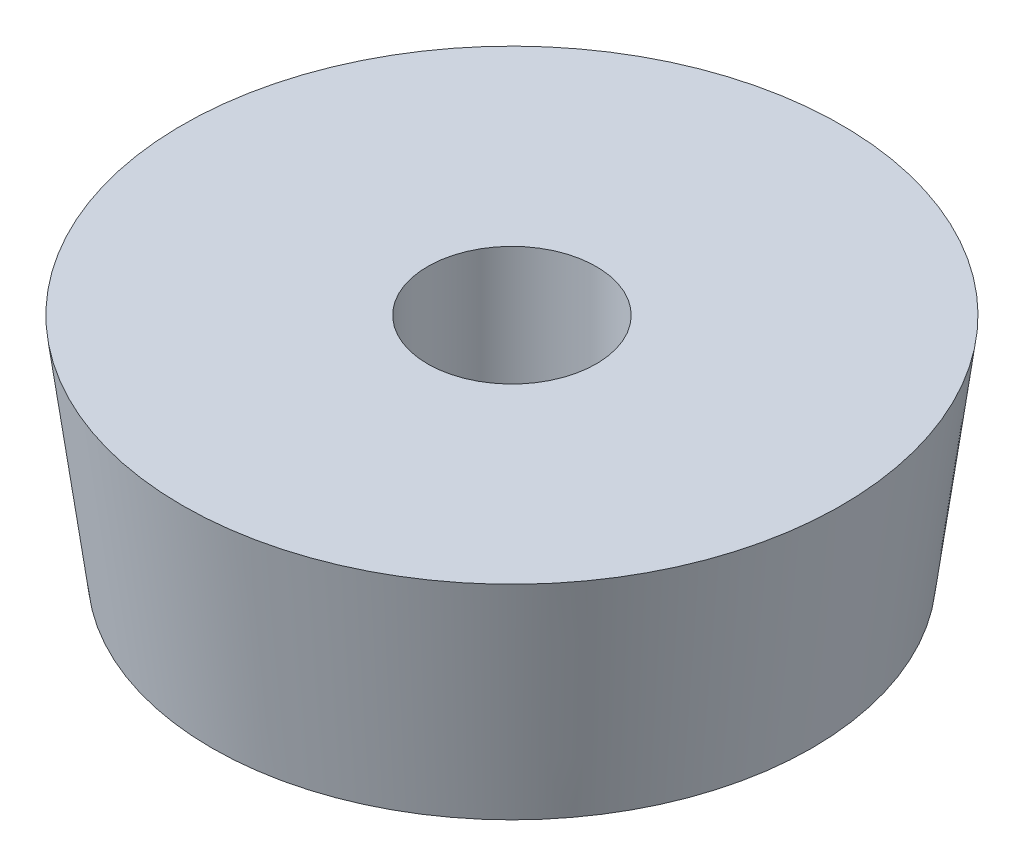
ISO-10303-21;
HEADER;
FILE_DESCRIPTION(('STEP AP214'),'2;1');
FILE_NAME('part.step','',(''),(''),'','','');
FILE_SCHEMA(('AUTOMOTIVE_DESIGN { 1 0 10303 214 1 1 1 1 }'));
ENDSEC;
DATA;
#1=APPLICATION_CONTEXT('core data for automotive mechanical design processes');
#2=APPLICATION_PROTOCOL_DEFINITION('international standard','automotive_design',2000,#1);
#3=PRODUCT_CONTEXT('',#1,'mechanical');
#4=PRODUCT('Part','Part','',(#3));
#5=PRODUCT_RELATED_PRODUCT_CATEGORY('part','',(#4));
#6=PRODUCT_DEFINITION_FORMATION('','',#4);
#7=PRODUCT_DEFINITION_CONTEXT('part definition',#1,'design');
#8=PRODUCT_DEFINITION('design','',#6,#7);
#9=PRODUCT_DEFINITION_SHAPE('','',#8);
#10=(LENGTH_UNIT() NAMED_UNIT(*) SI_UNIT(.MILLI.,.METRE.));
#11=(NAMED_UNIT(*) PLANE_ANGLE_UNIT() SI_UNIT($,.RADIAN.));
#12=(NAMED_UNIT(*) SI_UNIT($,.STERADIAN.) SOLID_ANGLE_UNIT());
#13=UNCERTAINTY_MEASURE_WITH_UNIT(LENGTH_MEASURE(1.E-05),#10,'distance_accuracy_value','');
#14=(GEOMETRIC_REPRESENTATION_CONTEXT(3) GLOBAL_UNCERTAINTY_ASSIGNED_CONTEXT((#13)) GLOBAL_UNIT_ASSIGNED_CONTEXT((#10,
#11,#12)) REPRESENTATION_CONTEXT('',''));
#15=CARTESIAN_POINT('',(0.,0.,0.));
#16=DIRECTION('',(0.,0.,1.));
#17=DIRECTION('',(1.,0.,0.));
#18=AXIS2_PLACEMENT_3D('',#15,#16,#17);
#19=CARTESIAN_POINT('',(0.,0.,0.));
#20=DIRECTION('',(0.,1.,0.));
#21=DIRECTION('',(0.,0.,1.));
#22=AXIS2_PLACEMENT_3D('',#19,#20,#21);
#23=CONICAL_SURFACE('',#22,50.8,0.130899693899575);
#24=CARTESIAN_POINT('',(0.,38.1,0.));
#25=DIRECTION('',(0.,1.,0.));
#26=DIRECTION('',(0.,0.,1.));
#27=AXIS2_PLACEMENT_3D('',#24,#25,#26);
#28=CIRCLE('',#27,55.8159601580798);
#29=CARTESIAN_POINT('',(0.,38.1,55.8159601580798));
#30=VERTEX_POINT('',#29);
#31=EDGE_CURVE('E10',#30,#30,#28,.T.);
#32=ORIENTED_EDGE('',*,*,#31,.F.);
#33=EDGE_LOOP('',(#32));
#34=FACE_BOUND('',#33,.T.);
#35=CARTESIAN_POINT('',(0.,0.,0.));
#36=DIRECTION('',(0.,1.,0.));
#37=DIRECTION('',(0.,0.,1.));
#38=AXIS2_PLACEMENT_3D('',#35,#36,#37);
#39=CIRCLE('',#38,50.8);
#40=CARTESIAN_POINT('',(0.,0.,50.8));
#41=VERTEX_POINT('',#40);
#42=EDGE_CURVE('E36',#41,#41,#39,.T.);
#43=ORIENTED_EDGE('',*,*,#42,.T.);
#44=EDGE_LOOP('',(#43));
#45=FACE_BOUND('',#44,.T.);
#46=ADVANCED_FACE('F30',(#34,#45),#23,.T.);
#47=CARTESIAN_POINT('',(0.,38.1,0.));
#48=DIRECTION('',(0.,1.,0.));
#49=DIRECTION('',(0.,0.,1.));
#50=AXIS2_PLACEMENT_3D('',#47,#48,#49);
#51=PLANE('',#50);
#52=CARTESIAN_POINT('',(0.,38.1,0.));
#53=DIRECTION('',(0.,1.,0.));
#54=DIRECTION('',(0.,0.,1.));
#55=AXIS2_PLACEMENT_3D('',#52,#53,#54);
#56=CIRCLE('',#55,14.2875);
#57=CARTESIAN_POINT('',(0.,38.1,14.2875));
#58=VERTEX_POINT('',#57);
#59=EDGE_CURVE('E44',#58,#58,#56,.T.);
#60=ORIENTED_EDGE('',*,*,#59,.F.);
#61=EDGE_LOOP('',(#60));
#62=FACE_BOUND('',#61,.T.);
#63=ORIENTED_EDGE('',*,*,#31,.T.);
#64=EDGE_LOOP('',(#63));
#65=FACE_BOUND('',#64,.T.);
#66=ADVANCED_FACE('F52',(#62,#65),#51,.T.);
#67=CARTESIAN_POINT('',(0.,0.,0.));
#68=DIRECTION('',(0.,1.,0.));
#69=DIRECTION('',(0.,0.,1.));
#70=AXIS2_PLACEMENT_3D('',#67,#68,#69);
#71=PLANE('',#70);
#72=CARTESIAN_POINT('',(0.,0.,0.));
#73=DIRECTION('',(0.,1.,0.));
#74=DIRECTION('',(0.,0.,1.));
#75=AXIS2_PLACEMENT_3D('',#72,#73,#74);
#76=CIRCLE('',#75,14.2875);
#77=CARTESIAN_POINT('',(0.,0.,14.2875));
#78=VERTEX_POINT('',#77);
#79=EDGE_CURVE('E40',#78,#78,#76,.T.);
#80=ORIENTED_EDGE('',*,*,#79,.T.);
#81=EDGE_LOOP('',(#80));
#82=FACE_BOUND('',#81,.T.);
#83=ORIENTED_EDGE('',*,*,#42,.F.);
#84=EDGE_LOOP('',(#83));
#85=FACE_BOUND('',#84,.T.);
#86=ADVANCED_FACE('F54',(#82,#85),#71,.F.);
#87=CARTESIAN_POINT('',(0.,0.,0.));
#88=DIRECTION('',(0.,1.,0.));
#89=DIRECTION('',(0.,0.,1.));
#90=AXIS2_PLACEMENT_3D('',#87,#88,#89);
#91=CYLINDRICAL_SURFACE('',#90,14.2875);
#92=CARTESIAN_POINT('',(0.,0.,14.2875));
#93=CARTESIAN_POINT('',(0.,0.396875,14.2875));
#94=CARTESIAN_POINT('',(0.,0.79375,14.2875));
#95=CARTESIAN_POINT('',(0.,1.5875,14.2875));
#96=CARTESIAN_POINT('',(0.,1.984375,14.2875));
#97=CARTESIAN_POINT('',(0.,2.778125,14.2875));
#98=CARTESIAN_POINT('',(0.,3.175,14.2875));
#99=CARTESIAN_POINT('',(0.,3.96875,14.2875));
#100=CARTESIAN_POINT('',(0.,4.365625,14.2875));
#101=CARTESIAN_POINT('',(0.,5.159375,14.2875));
#102=CARTESIAN_POINT('',(0.,5.55625,14.2875));
#103=CARTESIAN_POINT('',(0.,6.35,14.2875));
#104=CARTESIAN_POINT('',(0.,6.746875,14.2875));
#105=CARTESIAN_POINT('',(0.,7.540625,14.2875));
#106=CARTESIAN_POINT('',(0.,7.9375,14.2875));
#107=CARTESIAN_POINT('',(0.,8.73125,14.2875));
#108=CARTESIAN_POINT('',(0.,9.128125,14.2875));
#109=CARTESIAN_POINT('',(0.,9.921875,14.2875));
#110=CARTESIAN_POINT('',(0.,10.31875,14.2875));
#111=CARTESIAN_POINT('',(0.,11.1125,14.2875));
#112=CARTESIAN_POINT('',(0.,11.509375,14.2875));
#113=CARTESIAN_POINT('',(0.,12.303125,14.2875));
#114=CARTESIAN_POINT('',(0.,12.7,14.2875));
#115=CARTESIAN_POINT('',(0.,13.49375,14.2875));
#116=CARTESIAN_POINT('',(0.,13.890625,14.2875));
#117=CARTESIAN_POINT('',(0.,14.684375,14.2875));
#118=CARTESIAN_POINT('',(0.,15.08125,14.2875));
#119=CARTESIAN_POINT('',(0.,15.875,14.2875));
#120=CARTESIAN_POINT('',(0.,16.271875,14.2875));
#121=CARTESIAN_POINT('',(0.,17.065625,14.2875));
#122=CARTESIAN_POINT('',(0.,17.4625,14.2875));
#123=CARTESIAN_POINT('',(0.,18.25625,14.2875));
#124=CARTESIAN_POINT('',(0.,18.653125,14.2875));
#125=CARTESIAN_POINT('',(0.,19.446875,14.2875));
#126=CARTESIAN_POINT('',(0.,19.84375,14.2875));
#127=CARTESIAN_POINT('',(0.,20.6375,14.2875));
#128=CARTESIAN_POINT('',(0.,21.034375,14.2875));
#129=CARTESIAN_POINT('',(0.,21.828125,14.2875));
#130=CARTESIAN_POINT('',(0.,22.225,14.2875));
#131=CARTESIAN_POINT('',(0.,23.01875,14.2875));
#132=CARTESIAN_POINT('',(0.,23.415625,14.2875));
#133=CARTESIAN_POINT('',(0.,24.209375,14.2875));
#134=CARTESIAN_POINT('',(0.,24.60625,14.2875));
#135=CARTESIAN_POINT('',(0.,25.4,14.2875));
#136=CARTESIAN_POINT('',(0.,25.796875,14.2875));
#137=CARTESIAN_POINT('',(0.,26.590625,14.2875));
#138=CARTESIAN_POINT('',(0.,26.9875,14.2875));
#139=CARTESIAN_POINT('',(0.,27.78125,14.2875));
#140=CARTESIAN_POINT('',(0.,28.178125,14.2875));
#141=CARTESIAN_POINT('',(0.,28.971875,14.2875));
#142=CARTESIAN_POINT('',(0.,29.36875,14.2875));
#143=CARTESIAN_POINT('',(0.,30.1625,14.2875));
#144=CARTESIAN_POINT('',(0.,30.559375,14.2875));
#145=CARTESIAN_POINT('',(0.,31.353125,14.2875));
#146=CARTESIAN_POINT('',(0.,31.75,14.2875));
#147=CARTESIAN_POINT('',(0.,32.54375,14.2875));
#148=CARTESIAN_POINT('',(0.,32.940625,14.2875));
#149=CARTESIAN_POINT('',(0.,33.734375,14.2875));
#150=CARTESIAN_POINT('',(0.,34.13125,14.2875));
#151=CARTESIAN_POINT('',(0.,34.925,14.2875));
#152=CARTESIAN_POINT('',(0.,35.321875,14.2875));
#153=CARTESIAN_POINT('',(0.,36.115625,14.2875));
#154=CARTESIAN_POINT('',(0.,36.5125,14.2875));
#155=CARTESIAN_POINT('',(0.,37.30625,14.2875));
#156=CARTESIAN_POINT('',(0.,37.703125,14.2875));
#157=CARTESIAN_POINT('',(0.,38.1,14.2875));
#158=B_SPLINE_CURVE_WITH_KNOTS('',3,(#92,#93,#94,#95,#96,#97,#98,#99,#100,#101,#102,#103,#104,
#105,#106,#107,#108,#109,#110,#111,#112,#113,#114,#115,#116,#117,#118,#119,#120,#121,#122,#123,
#124,#125,#126,#127,#128,#129,#130,#131,#132,#133,#134,#135,#136,#137,#138,#139,#140,#141,#142,
#143,#144,#145,#146,#147,#148,#149,#150,#151,#152,#153,#154,#155,#156,#157),.UNSPECIFIED.,.F.,
.F.,(4,2,2,2,2,2,2,2,2,2,2,2,2,2,2,2,2,2,2,2,2,2,2,2,2,2,2,2,2,2,2,2,4),(0.,1.190625,2.38125,
3.571875,4.7625,5.953125,7.14375,8.334375,9.525,10.715625,11.90625,13.096875,14.2875,15.478125,
16.66875,17.859375,19.05,20.240625,21.43125,22.621875,23.8125,25.003125,26.19375,27.384375,
28.575,29.765625,30.95625,32.146875,33.3375,34.528125,35.71875,36.909375,38.1),.UNSPECIFIED.);
#159=EDGE_CURVE('BSEAM50',#78,#58,#158,.T.);
#160=ORIENTED_EDGE('',*,*,#79,.F.);
#161=ORIENTED_EDGE('',*,*,#59,.T.);
#162=ORIENTED_EDGE('',*,*,#159,.T.);
#163=ORIENTED_EDGE('',*,*,#159,.F.);
#164=EDGE_LOOP('',(#160,#162,#161,#163));
#165=FACE_BOUND('',#164,.T.);
#166=ADVANCED_FACE('F50',(#165),#91,.F.);
#167=CLOSED_SHELL('',(#46,#66,#86,#166));
#168=MANIFOLD_SOLID_BREP('B2',#167);
#169=ADVANCED_BREP_SHAPE_REPRESENTATION('',(#18,#168),#14);
#170=SHAPE_DEFINITION_REPRESENTATION(#9,#169);
ENDSEC;
END-ISO-10303-21;
